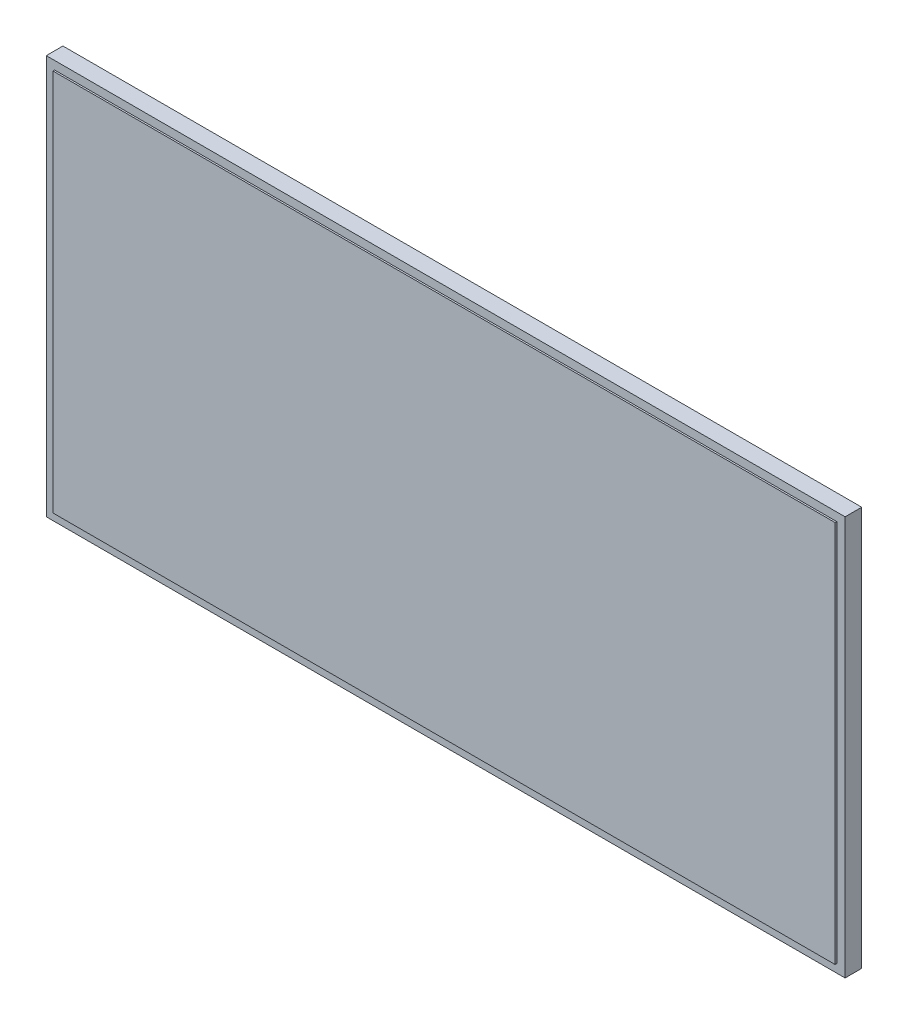
ISO-10303-21;
HEADER;
FILE_DESCRIPTION(('STEP AP214'),'2;1');
FILE_NAME('part.step','',(''),(''),'','','');
FILE_SCHEMA(('AUTOMOTIVE_DESIGN { 1 0 10303 214 1 1 1 1 }'));
ENDSEC;
DATA;
#1=APPLICATION_CONTEXT('core data for automotive mechanical design processes');
#2=APPLICATION_PROTOCOL_DEFINITION('international standard','automotive_design',2000,#1);
#3=PRODUCT_CONTEXT('',#1,'mechanical');
#4=PRODUCT('Part','Part','',(#3));
#5=PRODUCT_RELATED_PRODUCT_CATEGORY('part','',(#4));
#6=PRODUCT_DEFINITION_FORMATION('','',#4);
#7=PRODUCT_DEFINITION_CONTEXT('part definition',#1,'design');
#8=PRODUCT_DEFINITION('design','',#6,#7);
#9=PRODUCT_DEFINITION_SHAPE('','',#8);
#10=(LENGTH_UNIT() NAMED_UNIT(*) SI_UNIT(.MILLI.,.METRE.));
#11=(NAMED_UNIT(*) PLANE_ANGLE_UNIT() SI_UNIT($,.RADIAN.));
#12=(NAMED_UNIT(*) SI_UNIT($,.STERADIAN.) SOLID_ANGLE_UNIT());
#13=UNCERTAINTY_MEASURE_WITH_UNIT(LENGTH_MEASURE(1.E-05),#10,'distance_accuracy_value','');
#14=(GEOMETRIC_REPRESENTATION_CONTEXT(3) GLOBAL_UNCERTAINTY_ASSIGNED_CONTEXT((#13)) GLOBAL_UNIT_ASSIGNED_CONTEXT((#10,
#11,#12)) REPRESENTATION_CONTEXT('',''));
#15=CARTESIAN_POINT('',(0.,0.,0.));
#16=DIRECTION('',(0.,0.,1.));
#17=DIRECTION('',(1.,0.,0.));
#18=AXIS2_PLACEMENT_3D('',#15,#16,#17);
#19=CARTESIAN_POINT('',(0.,0.,127.));
#20=DIRECTION('',(-1.,0.,0.));
#21=DIRECTION('',(0.,-1.,0.));
#22=AXIS2_PLACEMENT_3D('',#19,#20,#21);
#23=PLANE('',#22);
#24=DIRECTION('',(0.,1.,0.));
#25=VECTOR('',#24,1.);
#26=CARTESIAN_POINT('',(0.,0.,0.));
#27=LINE('',#26,#25);
#28=CARTESIAN_POINT('',(3.73272344380113E-13,-3048.,0.));
#29=VERTEX_POINT('',#28);
#30=CARTESIAN_POINT('',(0.,0.,0.));
#31=VERTEX_POINT('',#30);
#32=EDGE_CURVE('E209',#29,#31,#27,.T.);
#33=ORIENTED_EDGE('',*,*,#32,.T.);
#34=DIRECTION('',(0.,0.,-1.));
#35=VECTOR('',#34,1.);
#36=CARTESIAN_POINT('',(0.,0.,127.));
#37=LINE('',#36,#35);
#38=CARTESIAN_POINT('',(0.,0.,127.));
#39=VERTEX_POINT('',#38);
#40=EDGE_CURVE('E12',#39,#31,#37,.T.);
#41=ORIENTED_EDGE('',*,*,#40,.F.);
#42=DIRECTION('',(0.,1.,0.));
#43=VECTOR('',#42,1.);
#44=CARTESIAN_POINT('',(0.,0.,127.));
#45=LINE('',#44,#43);
#46=CARTESIAN_POINT('',(3.73272344380113E-13,-3048.,127.));
#47=VERTEX_POINT('',#46);
#48=EDGE_CURVE('E210',#47,#39,#45,.T.);
#49=ORIENTED_EDGE('',*,*,#48,.F.);
#50=DIRECTION('',(0.,0.,-1.));
#51=VECTOR('',#50,1.);
#52=CARTESIAN_POINT('',(3.73272344380113E-13,-3048.,127.));
#53=LINE('',#52,#51);
#54=EDGE_CURVE('E216',#47,#29,#53,.T.);
#55=ORIENTED_EDGE('',*,*,#54,.T.);
#56=EDGE_LOOP('',(#33,#41,#49,#55));
#57=FACE_BOUND('',#56,.T.);
#58=ADVANCED_FACE('F41',(#57),#23,.F.);
#59=CARTESIAN_POINT('',(0.,0.,127.));
#60=DIRECTION('',(0.,-1.,0.));
#61=DIRECTION('',(1.,0.,0.));
#62=AXIS2_PLACEMENT_3D('',#59,#60,#61);
#63=PLANE('',#62);
#64=DIRECTION('',(-1.,0.,0.));
#65=VECTOR('',#64,1.);
#66=CARTESIAN_POINT('',(0.,0.,0.));
#67=LINE('',#66,#65);
#68=CARTESIAN_POINT('',(-6096.,-7.46544688760227E-13,0.));
#69=VERTEX_POINT('',#68);
#70=EDGE_CURVE('E219',#31,#69,#67,.T.);
#71=ORIENTED_EDGE('',*,*,#70,.T.);
#72=DIRECTION('',(0.,0.,-1.));
#73=VECTOR('',#72,1.);
#74=CARTESIAN_POINT('',(-6096.,-7.46544688760227E-13,127.));
#75=LINE('',#74,#73);
#76=CARTESIAN_POINT('',(-6096.,-7.46544688760227E-13,127.));
#77=VERTEX_POINT('',#76);
#78=EDGE_CURVE('E48',#77,#69,#75,.T.);
#79=ORIENTED_EDGE('',*,*,#78,.F.);
#80=DIRECTION('',(-1.,0.,0.));
#81=VECTOR('',#80,1.);
#82=CARTESIAN_POINT('',(0.,0.,127.));
#83=LINE('',#82,#81);
#84=EDGE_CURVE('E92',#39,#77,#83,.T.);
#85=ORIENTED_EDGE('',*,*,#84,.F.);
#86=ORIENTED_EDGE('',*,*,#40,.T.);
#87=EDGE_LOOP('',(#71,#79,#85,#86));
#88=FACE_BOUND('',#87,.T.);
#89=ADVANCED_FACE('F247',(#88),#63,.F.);
#90=CARTESIAN_POINT('',(-6096.,-7.46544688760227E-13,127.));
#91=DIRECTION('',(1.,0.,0.));
#92=DIRECTION('',(0.,0.,-1.));
#93=AXIS2_PLACEMENT_3D('',#90,#91,#92);
#94=PLANE('',#93);
#95=DIRECTION('',(0.,-1.,0.));
#96=VECTOR('',#95,1.);
#97=CARTESIAN_POINT('',(-6096.,-7.46544688760227E-13,0.));
#98=LINE('',#97,#96);
#99=CARTESIAN_POINT('',(-6096.,-3048.,0.));
#100=VERTEX_POINT('',#99);
#101=EDGE_CURVE('E221',#69,#100,#98,.T.);
#102=ORIENTED_EDGE('',*,*,#101,.T.);
#103=DIRECTION('',(0.,0.,-1.));
#104=VECTOR('',#103,1.);
#105=CARTESIAN_POINT('',(-6096.,-3048.,127.));
#106=LINE('',#105,#104);
#107=CARTESIAN_POINT('',(-6096.,-3048.,127.));
#108=VERTEX_POINT('',#107);
#109=EDGE_CURVE('E225',#108,#100,#106,.T.);
#110=ORIENTED_EDGE('',*,*,#109,.F.);
#111=DIRECTION('',(0.,-1.,0.));
#112=VECTOR('',#111,1.);
#113=CARTESIAN_POINT('',(-6096.,-7.46544688760227E-13,127.));
#114=LINE('',#113,#112);
#115=EDGE_CURVE('E213',#77,#108,#114,.T.);
#116=ORIENTED_EDGE('',*,*,#115,.F.);
#117=ORIENTED_EDGE('',*,*,#78,.T.);
#118=EDGE_LOOP('',(#102,#110,#116,#117));
#119=FACE_BOUND('',#118,.T.);
#120=ADVANCED_FACE('F230',(#119),#94,.F.);
#121=CARTESIAN_POINT('',(3.73272344380113E-13,-3048.,127.));
#122=DIRECTION('',(0.,1.,0.));
#123=DIRECTION('',(-1.,0.,0.));
#124=AXIS2_PLACEMENT_3D('',#121,#122,#123);
#125=PLANE('',#124);
#126=DIRECTION('',(1.,0.,0.));
#127=VECTOR('',#126,1.);
#128=CARTESIAN_POINT('',(3.73272344380113E-13,-3048.,0.));
#129=LINE('',#128,#127);
#130=EDGE_CURVE('E85',#100,#29,#129,.T.);
#131=ORIENTED_EDGE('',*,*,#130,.T.);
#132=ORIENTED_EDGE('',*,*,#54,.F.);
#133=DIRECTION('',(1.,0.,0.));
#134=VECTOR('',#133,1.);
#135=CARTESIAN_POINT('',(3.73272344380113E-13,-3048.,127.));
#136=LINE('',#135,#134);
#137=EDGE_CURVE('E64',#108,#47,#136,.T.);
#138=ORIENTED_EDGE('',*,*,#137,.F.);
#139=ORIENTED_EDGE('',*,*,#109,.T.);
#140=EDGE_LOOP('',(#131,#132,#138,#139));
#141=FACE_BOUND('',#140,.T.);
#142=ADVANCED_FACE('F238',(#141),#125,.F.);
#143=CARTESIAN_POINT('',(0.,0.,127.));
#144=DIRECTION('',(0.,0.,-1.));
#145=DIRECTION('',(-1.,0.,0.));
#146=AXIS2_PLACEMENT_3D('',#143,#144,#145);
#147=PLANE('',#146);
#148=DIRECTION('',(-1.,0.,0.));
#149=VECTOR('',#148,1.);
#150=CARTESIAN_POINT('',(-63.5000000000003,-63.5,127.));
#151=LINE('',#150,#149);
#152=CARTESIAN_POINT('',(-63.5000000000003,-63.5,127.));
#153=VERTEX_POINT('',#152);
#154=CARTESIAN_POINT('',(-6032.5,-63.5000000000007,127.));
#155=VERTEX_POINT('',#154);
#156=EDGE_CURVE('E55',#153,#155,#151,.T.);
#157=ORIENTED_EDGE('',*,*,#156,.F.);
#158=DIRECTION('',(0.,1.,0.));
#159=VECTOR('',#158,1.);
#160=CARTESIAN_POINT('',(-63.5000000000003,-63.5,127.));
#161=LINE('',#160,#159);
#162=CARTESIAN_POINT('',(-63.5,-2984.5,127.));
#163=VERTEX_POINT('',#162);
#164=EDGE_CURVE('E200',#163,#153,#161,.T.);
#165=ORIENTED_EDGE('',*,*,#164,.F.);
#166=DIRECTION('',(1.,0.,0.));
#167=VECTOR('',#166,1.);
#168=CARTESIAN_POINT('',(-63.5,-2984.5,127.));
#169=LINE('',#168,#167);
#170=CARTESIAN_POINT('',(-6032.5,-2984.5,126.999999999998));
#171=VERTEX_POINT('',#170);
#172=EDGE_CURVE('E204',#171,#163,#169,.T.);
#173=ORIENTED_EDGE('',*,*,#172,.F.);
#174=DIRECTION('',(0.,-1.,0.));
#175=VECTOR('',#174,1.);
#176=CARTESIAN_POINT('',(-6032.5,-63.5000000000007,127.));
#177=LINE('',#176,#175);
#178=EDGE_CURVE('E145',#155,#171,#177,.T.);
#179=ORIENTED_EDGE('',*,*,#178,.F.);
#180=EDGE_LOOP('',(#157,#165,#173,#179));
#181=FACE_BOUND('',#180,.T.);
#182=ORIENTED_EDGE('',*,*,#48,.T.);
#183=ORIENTED_EDGE('',*,*,#84,.T.);
#184=ORIENTED_EDGE('',*,*,#115,.T.);
#185=ORIENTED_EDGE('',*,*,#137,.T.);
#186=EDGE_LOOP('',(#182,#183,#184,#185));
#187=FACE_BOUND('',#186,.T.);
#188=ADVANCED_FACE('F240',(#181,#187),#147,.F.);
#189=CARTESIAN_POINT('',(0.,0.,0.));
#190=DIRECTION('',(0.,0.,-1.));
#191=DIRECTION('',(-1.,0.,0.));
#192=AXIS2_PLACEMENT_3D('',#189,#190,#191);
#193=PLANE('',#192);
#194=DIRECTION('',(0.,1.,0.));
#195=VECTOR('',#194,1.);
#196=CARTESIAN_POINT('',(-63.5000000000003,-63.5,0.));
#197=LINE('',#196,#195);
#198=CARTESIAN_POINT('',(-63.5,-2984.5,-1.77635683940025E-12));
#199=VERTEX_POINT('',#198);
#200=CARTESIAN_POINT('',(-63.5,-63.5000000000007,-1.77635683940025E-12));
#201=VERTEX_POINT('',#200);
#202=EDGE_CURVE('E197',#199,#201,#197,.T.);
#203=ORIENTED_EDGE('',*,*,#202,.T.);
#204=DIRECTION('',(-1.,0.,0.));
#205=VECTOR('',#204,1.);
#206=CARTESIAN_POINT('',(-63.5000000000003,-63.5,0.));
#207=LINE('',#206,#205);
#208=CARTESIAN_POINT('',(-6032.5,-63.5000000000007,-1.77635683940025E-12));
#209=VERTEX_POINT('',#208);
#210=EDGE_CURVE('E206',#201,#209,#207,.T.);
#211=ORIENTED_EDGE('',*,*,#210,.T.);
#212=DIRECTION('',(0.,-1.,0.));
#213=VECTOR('',#212,1.);
#214=CARTESIAN_POINT('',(-6032.5,-63.5000000000007,0.));
#215=LINE('',#214,#213);
#216=CARTESIAN_POINT('',(-6032.5,-2984.5,0.));
#217=VERTEX_POINT('',#216);
#218=EDGE_CURVE('E191',#209,#217,#215,.T.);
#219=ORIENTED_EDGE('',*,*,#218,.T.);
#220=DIRECTION('',(1.,0.,0.));
#221=VECTOR('',#220,1.);
#222=CARTESIAN_POINT('',(-63.5,-2984.5,0.));
#223=LINE('',#222,#221);
#224=EDGE_CURVE('E194',#217,#199,#223,.T.);
#225=ORIENTED_EDGE('',*,*,#224,.T.);
#226=EDGE_LOOP('',(#203,#211,#219,#225));
#227=FACE_BOUND('',#226,.T.);
#228=ORIENTED_EDGE('',*,*,#32,.F.);
#229=ORIENTED_EDGE('',*,*,#130,.F.);
#230=ORIENTED_EDGE('',*,*,#101,.F.);
#231=ORIENTED_EDGE('',*,*,#70,.F.);
#232=EDGE_LOOP('',(#228,#229,#230,#231));
#233=FACE_BOUND('',#232,.T.);
#234=ADVANCED_FACE('F234',(#227,#233),#193,.T.);
#235=CARTESIAN_POINT('',(0.,0.,-12.7));
#236=DIRECTION('',(0.,0.,-1.));
#237=DIRECTION('',(-1.,0.,0.));
#238=AXIS2_PLACEMENT_3D('',#235,#236,#237);
#239=PLANE('',#238);
#240=DIRECTION('',(0.,-1.,0.));
#241=VECTOR('',#240,1.);
#242=CARTESIAN_POINT('',(-6032.5,-63.5000000000007,-12.6999999999997));
#243=LINE('',#242,#241);
#244=CARTESIAN_POINT('',(-6032.5,-63.5000000000007,-12.6999999999997));
#245=VERTEX_POINT('',#244);
#246=CARTESIAN_POINT('',(-6032.5,-2984.5,-12.6999999999997));
#247=VERTEX_POINT('',#246);
#248=EDGE_CURVE('E149',#245,#247,#243,.T.);
#249=ORIENTED_EDGE('',*,*,#248,.F.);
#250=DIRECTION('',(-1.,0.,0.));
#251=VECTOR('',#250,1.);
#252=CARTESIAN_POINT('',(-6032.5,-63.5000000000007,-12.6999999999997));
#253=LINE('',#252,#251);
#254=CARTESIAN_POINT('',(-63.5,-63.5000000000007,-12.6999999999997));
#255=VERTEX_POINT('',#254);
#256=EDGE_CURVE('E175',#255,#245,#253,.T.);
#257=ORIENTED_EDGE('',*,*,#256,.F.);
#258=DIRECTION('',(0.,1.,0.));
#259=VECTOR('',#258,1.);
#260=CARTESIAN_POINT('',(-63.5,-63.5000000000007,-12.6999999999997));
#261=LINE('',#260,#259);
#262=CARTESIAN_POINT('',(-63.5,-2984.5,-12.7000000000015));
#263=VERTEX_POINT('',#262);
#264=EDGE_CURVE('E180',#263,#255,#261,.T.);
#265=ORIENTED_EDGE('',*,*,#264,.F.);
#266=DIRECTION('',(1.,0.,0.));
#267=VECTOR('',#266,1.);
#268=CARTESIAN_POINT('',(-6032.5,-2984.5,-12.6999999999997));
#269=LINE('',#268,#267);
#270=EDGE_CURVE('E169',#247,#263,#269,.T.);
#271=ORIENTED_EDGE('',*,*,#270,.F.);
#272=EDGE_LOOP('',(#249,#257,#265,#271));
#273=FACE_BOUND('',#272,.T.);
#274=ADVANCED_FACE('F279',(#273),#239,.T.);
#275=CARTESIAN_POINT('',(-6032.5,-63.5000000000007,-6670.78952959117));
#276=DIRECTION('',(-1.,0.,0.));
#277=DIRECTION('',(0.,0.,1.));
#278=AXIS2_PLACEMENT_3D('',#275,#276,#277);
#279=PLANE('',#278);
#280=DIRECTION('',(0.,0.,1.));
#281=VECTOR('',#280,1.);
#282=CARTESIAN_POINT('',(-6032.5,-2984.5,-6670.78952959117));
#283=LINE('',#282,#281);
#284=EDGE_CURVE('E148',#247,#217,#283,.T.);
#285=ORIENTED_EDGE('',*,*,#284,.T.);
#286=ORIENTED_EDGE('',*,*,#218,.F.);
#287=DIRECTION('',(0.,0.,1.));
#288=VECTOR('',#287,1.);
#289=CARTESIAN_POINT('',(-6032.5,-63.5000000000007,-6670.78952959117));
#290=LINE('',#289,#288);
#291=EDGE_CURVE('E174',#245,#209,#290,.T.);
#292=ORIENTED_EDGE('',*,*,#291,.F.);
#293=ORIENTED_EDGE('',*,*,#248,.T.);
#294=EDGE_LOOP('',(#285,#286,#292,#293));
#295=FACE_BOUND('',#294,.T.);
#296=ADVANCED_FACE('F288',(#295),#279,.T.);
#297=CARTESIAN_POINT('',(-6032.5,-63.5000000000007,-6670.78952959117));
#298=DIRECTION('',(0.,1.,0.));
#299=DIRECTION('',(0.,0.,1.));
#300=AXIS2_PLACEMENT_3D('',#297,#298,#299);
#301=PLANE('',#300);
#302=ORIENTED_EDGE('',*,*,#291,.T.);
#303=ORIENTED_EDGE('',*,*,#210,.F.);
#304=DIRECTION('',(0.,0.,1.));
#305=VECTOR('',#304,1.);
#306=CARTESIAN_POINT('',(-63.5,-63.5000000000007,-6670.78952959117));
#307=LINE('',#306,#305);
#308=EDGE_CURVE('E179',#255,#201,#307,.T.);
#309=ORIENTED_EDGE('',*,*,#308,.F.);
#310=ORIENTED_EDGE('',*,*,#256,.T.);
#311=EDGE_LOOP('',(#302,#303,#309,#310));
#312=FACE_BOUND('',#311,.T.);
#313=ADVANCED_FACE('F298',(#312),#301,.T.);
#314=CARTESIAN_POINT('',(-63.5,-63.5000000000007,-6670.78952959117));
#315=DIRECTION('',(1.,0.,0.));
#316=DIRECTION('',(0.,0.,-1.));
#317=AXIS2_PLACEMENT_3D('',#314,#315,#316);
#318=PLANE('',#317);
#319=ORIENTED_EDGE('',*,*,#308,.T.);
#320=ORIENTED_EDGE('',*,*,#202,.F.);
#321=DIRECTION('',(0.,0.,1.));
#322=VECTOR('',#321,1.);
#323=CARTESIAN_POINT('',(-63.5,-2984.5,-6670.78952959117));
#324=LINE('',#323,#322);
#325=EDGE_CURVE('E184',#263,#199,#324,.T.);
#326=ORIENTED_EDGE('',*,*,#325,.F.);
#327=ORIENTED_EDGE('',*,*,#264,.T.);
#328=EDGE_LOOP('',(#319,#320,#326,#327));
#329=FACE_BOUND('',#328,.T.);
#330=ADVANCED_FACE('F308',(#329),#318,.T.);
#331=CARTESIAN_POINT('',(-6032.5,-2984.5,-6670.78952959117));
#332=DIRECTION('',(0.,-1.,0.));
#333=DIRECTION('',(0.,0.,-1.));
#334=AXIS2_PLACEMENT_3D('',#331,#332,#333);
#335=PLANE('',#334);
#336=ORIENTED_EDGE('',*,*,#325,.T.);
#337=ORIENTED_EDGE('',*,*,#224,.F.);
#338=ORIENTED_EDGE('',*,*,#284,.F.);
#339=ORIENTED_EDGE('',*,*,#270,.T.);
#340=EDGE_LOOP('',(#336,#337,#338,#339));
#341=FACE_BOUND('',#340,.T.);
#342=ADVANCED_FACE('F319',(#341),#335,.T.);
#343=ORIENTED_EDGE('',*,*,#172,.T.);
#344=CARTESIAN_POINT('',(-63.5,-2984.5,139.7));
#345=VERTEX_POINT('',#344);
#346=EDGE_CURVE('E155',#163,#345,#324,.T.);
#347=ORIENTED_EDGE('',*,*,#346,.T.);
#348=DIRECTION('',(1.,0.,0.));
#349=VECTOR('',#348,1.);
#350=CARTESIAN_POINT('',(-6032.5,-2984.5,139.7));
#351=LINE('',#350,#349);
#352=CARTESIAN_POINT('',(-6032.5,-2984.5,139.7));
#353=VERTEX_POINT('',#352);
#354=EDGE_CURVE('E152',#353,#345,#351,.T.);
#355=ORIENTED_EDGE('',*,*,#354,.F.);
#356=EDGE_CURVE('E139',#171,#353,#283,.T.);
#357=ORIENTED_EDGE('',*,*,#356,.F.);
#358=EDGE_LOOP('',(#343,#347,#355,#357));
#359=FACE_BOUND('',#358,.T.);
#360=ADVANCED_FACE('F153',(#359),#335,.T.);
#361=ORIENTED_EDGE('',*,*,#156,.T.);
#362=CARTESIAN_POINT('',(-6032.5,-63.5000000000007,139.7));
#363=VERTEX_POINT('',#362);
#364=EDGE_CURVE('E178',#155,#363,#290,.T.);
#365=ORIENTED_EDGE('',*,*,#364,.T.);
#366=DIRECTION('',(-1.,0.,0.));
#367=VECTOR('',#366,1.);
#368=CARTESIAN_POINT('',(-6032.5,-63.5000000000007,139.7));
#369=LINE('',#368,#367);
#370=CARTESIAN_POINT('',(-63.5,-63.5000000000007,139.7));
#371=VERTEX_POINT('',#370);
#372=EDGE_CURVE('E164',#371,#363,#369,.T.);
#373=ORIENTED_EDGE('',*,*,#372,.F.);
#374=EDGE_CURVE('E183',#153,#371,#307,.T.);
#375=ORIENTED_EDGE('',*,*,#374,.F.);
#376=EDGE_LOOP('',(#361,#365,#373,#375));
#377=FACE_BOUND('',#376,.T.);
#378=ADVANCED_FACE('F311',(#377),#301,.T.);
#379=ORIENTED_EDGE('',*,*,#164,.T.);
#380=ORIENTED_EDGE('',*,*,#374,.T.);
#381=DIRECTION('',(0.,1.,0.));
#382=VECTOR('',#381,1.);
#383=CARTESIAN_POINT('',(-63.5,-63.5000000000007,139.7));
#384=LINE('',#383,#382);
#385=EDGE_CURVE('E159',#345,#371,#384,.T.);
#386=ORIENTED_EDGE('',*,*,#385,.F.);
#387=ORIENTED_EDGE('',*,*,#346,.F.);
#388=EDGE_LOOP('',(#379,#380,#386,#387));
#389=FACE_BOUND('',#388,.T.);
#390=ADVANCED_FACE('F322',(#389),#318,.T.);
#391=ORIENTED_EDGE('',*,*,#178,.T.);
#392=ORIENTED_EDGE('',*,*,#356,.T.);
#393=DIRECTION('',(0.,-1.,0.));
#394=VECTOR('',#393,1.);
#395=CARTESIAN_POINT('',(-6032.5,-63.5000000000007,139.7));
#396=LINE('',#395,#394);
#397=EDGE_CURVE('E144',#363,#353,#396,.T.);
#398=ORIENTED_EDGE('',*,*,#397,.F.);
#399=ORIENTED_EDGE('',*,*,#364,.F.);
#400=EDGE_LOOP('',(#391,#392,#398,#399));
#401=FACE_BOUND('',#400,.T.);
#402=ADVANCED_FACE('F141',(#401),#279,.T.);
#403=CARTESIAN_POINT('',(0.,0.,139.7));
#404=DIRECTION('',(0.,0.,1.));
#405=DIRECTION('',(1.,0.,0.));
#406=AXIS2_PLACEMENT_3D('',#403,#404,#405);
#407=PLANE('',#406);
#408=ORIENTED_EDGE('',*,*,#397,.T.);
#409=ORIENTED_EDGE('',*,*,#354,.T.);
#410=ORIENTED_EDGE('',*,*,#385,.T.);
#411=ORIENTED_EDGE('',*,*,#372,.T.);
#412=EDGE_LOOP('',(#408,#409,#410,#411));
#413=FACE_BOUND('',#412,.T.);
#414=ADVANCED_FACE('F162',(#413),#407,.T.);
#415=CLOSED_SHELL('',(#58,#89,#120,#142,#188,#234,#274,#296,#313,#330,#342,#360,#378,#390,#402,#414));
#416=MANIFOLD_SOLID_BREP('B2',#415);
#417=ADVANCED_BREP_SHAPE_REPRESENTATION('',(#18,#416),#14);
#418=SHAPE_DEFINITION_REPRESENTATION(#9,#417);
ENDSEC;
END-ISO-10303-21;
